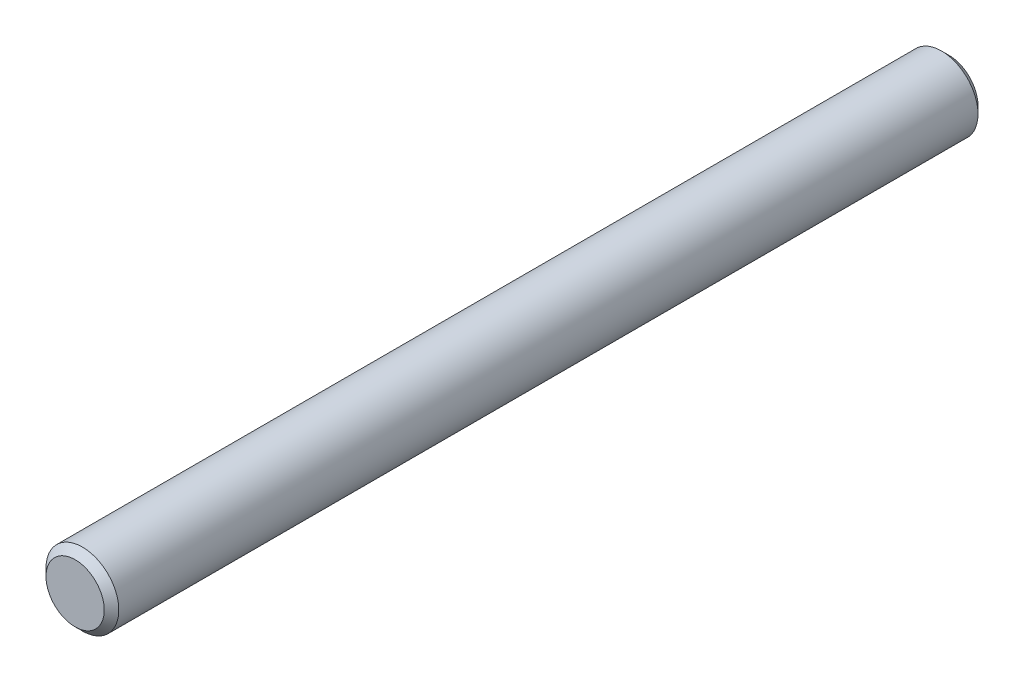
ISO-10303-21;
HEADER;
FILE_DESCRIPTION(('STEP AP214'),'2;1');
FILE_NAME('part.step','',(''),(''),'','','');
FILE_SCHEMA(('AUTOMOTIVE_DESIGN { 1 0 10303 214 1 1 1 1 }'));
ENDSEC;
DATA;
#1=APPLICATION_CONTEXT('core data for automotive mechanical design processes');
#2=APPLICATION_PROTOCOL_DEFINITION('international standard','automotive_design',2000,#1);
#3=PRODUCT_CONTEXT('',#1,'mechanical');
#4=PRODUCT('Part','Part','',(#3));
#5=PRODUCT_RELATED_PRODUCT_CATEGORY('part','',(#4));
#6=PRODUCT_DEFINITION_FORMATION('','',#4);
#7=PRODUCT_DEFINITION_CONTEXT('part definition',#1,'design');
#8=PRODUCT_DEFINITION('design','',#6,#7);
#9=PRODUCT_DEFINITION_SHAPE('','',#8);
#10=(LENGTH_UNIT() NAMED_UNIT(*) SI_UNIT(.MILLI.,.METRE.));
#11=(NAMED_UNIT(*) PLANE_ANGLE_UNIT() SI_UNIT($,.RADIAN.));
#12=(NAMED_UNIT(*) SI_UNIT($,.STERADIAN.) SOLID_ANGLE_UNIT());
#13=UNCERTAINTY_MEASURE_WITH_UNIT(LENGTH_MEASURE(1.E-05),#10,'distance_accuracy_value','');
#14=(GEOMETRIC_REPRESENTATION_CONTEXT(3) GLOBAL_UNCERTAINTY_ASSIGNED_CONTEXT((#13)) GLOBAL_UNIT_ASSIGNED_CONTEXT((#10,
#11,#12)) REPRESENTATION_CONTEXT('',''));
#15=CARTESIAN_POINT('',(0.,0.,0.));
#16=DIRECTION('',(0.,0.,1.));
#17=DIRECTION('',(1.,0.,0.));
#18=AXIS2_PLACEMENT_3D('',#15,#16,#17);
#19=CARTESIAN_POINT('',(0.,0.,38.1));
#20=DIRECTION('',(0.,0.,-1.));
#21=DIRECTION('',(-1.,0.,0.));
#22=AXIS2_PLACEMENT_3D('',#19,#20,#21);
#23=CYLINDRICAL_SURFACE('',#22,3.175);
#24=CARTESIAN_POINT('',(0.,0.,-37.4649999999999));
#25=DIRECTION('',(0.,0.,1.));
#26=DIRECTION('',(1.,0.,0.));
#27=AXIS2_PLACEMENT_3D('',#24,#25,#26);
#28=CIRCLE('',#27,3.175);
#29=CARTESIAN_POINT('',(-3.175,0.,-37.4649999999999));
#30=VERTEX_POINT('',#29);
#31=EDGE_CURVE('E41',#30,#30,#28,.T.);
#32=CARTESIAN_POINT('',(0.,0.,37.465));
#33=DIRECTION('',(0.,0.,1.));
#34=DIRECTION('',(1.,0.,0.));
#35=AXIS2_PLACEMENT_3D('',#32,#33,#34);
#36=CIRCLE('',#35,3.175);
#37=CARTESIAN_POINT('',(-3.175,0.,37.465));
#38=VERTEX_POINT('',#37);
#39=EDGE_CURVE('E45',#38,#38,#36,.F.);
#40=CARTESIAN_POINT('',(-3.175,0.,-37.4649999999999));
#41=CARTESIAN_POINT('',(-3.175,0.,-36.6844791666666));
#42=CARTESIAN_POINT('',(-3.175,0.,-35.9039583333333));
#43=CARTESIAN_POINT('',(-3.175,0.,-34.3429166666666));
#44=CARTESIAN_POINT('',(-3.175,0.,-33.5623958333333));
#45=CARTESIAN_POINT('',(-3.175,0.,-32.0013541666666));
#46=CARTESIAN_POINT('',(-3.175,0.,-31.2208333333333));
#47=CARTESIAN_POINT('',(-3.175,0.,-29.6597916666666));
#48=CARTESIAN_POINT('',(-3.175,0.,-28.8792708333333));
#49=CARTESIAN_POINT('',(-3.175,0.,-27.3182291666666));
#50=CARTESIAN_POINT('',(-3.175,0.,-26.5377083333333));
#51=CARTESIAN_POINT('',(-3.175,0.,-24.9766666666666));
#52=CARTESIAN_POINT('',(-3.175,0.,-24.1961458333333));
#53=CARTESIAN_POINT('',(-3.175,0.,-22.6351041666666));
#54=CARTESIAN_POINT('',(-3.175,0.,-21.8545833333333));
#55=CARTESIAN_POINT('',(-3.175,0.,-20.2935416666666));
#56=CARTESIAN_POINT('',(-3.175,0.,-19.5130208333333));
#57=CARTESIAN_POINT('',(-3.175,0.,-17.9519791666666));
#58=CARTESIAN_POINT('',(-3.175,0.,-17.1714583333333));
#59=CARTESIAN_POINT('',(-3.175,0.,-15.6104166666666));
#60=CARTESIAN_POINT('',(-3.175,0.,-14.8298958333333));
#61=CARTESIAN_POINT('',(-3.175,0.,-13.2688541666666));
#62=CARTESIAN_POINT('',(-3.175,0.,-12.4883333333333));
#63=CARTESIAN_POINT('',(-3.175,0.,-10.9272916666666));
#64=CARTESIAN_POINT('',(-3.175,0.,-10.1467708333333));
#65=CARTESIAN_POINT('',(-3.175,0.,-8.58572916666663));
#66=CARTESIAN_POINT('',(-3.175,0.,-7.80520833333329));
#67=CARTESIAN_POINT('',(-3.175,0.,-6.24416666666663));
#68=CARTESIAN_POINT('',(-3.175,0.,-5.46364583333329));
#69=CARTESIAN_POINT('',(-3.175,0.,-3.90260416666663));
#70=CARTESIAN_POINT('',(-3.175,0.,-3.1220833333333));
#71=CARTESIAN_POINT('',(-3.175,0.,-1.56104166666663));
#72=CARTESIAN_POINT('',(-3.175,0.,-0.780520833333298));
#73=CARTESIAN_POINT('',(-3.175,0.,0.780520833333367));
#74=CARTESIAN_POINT('',(-3.175,0.,1.5610416666667));
#75=CARTESIAN_POINT('',(-3.175,0.,3.12208333333337));
#76=CARTESIAN_POINT('',(-3.175,0.,3.9026041666667));
#77=CARTESIAN_POINT('',(-3.175,0.,5.46364583333337));
#78=CARTESIAN_POINT('',(-3.175,0.,6.2441666666667));
#79=CARTESIAN_POINT('',(-3.175,0.,7.80520833333337));
#80=CARTESIAN_POINT('',(-3.175,0.,8.5857291666667));
#81=CARTESIAN_POINT('',(-3.175,0.,10.1467708333334));
#82=CARTESIAN_POINT('',(-3.175,0.,10.9272916666667));
#83=CARTESIAN_POINT('',(-3.175,0.,12.4883333333334));
#84=CARTESIAN_POINT('',(-3.175,0.,13.2688541666667));
#85=CARTESIAN_POINT('',(-3.175,0.,14.8298958333334));
#86=CARTESIAN_POINT('',(-3.175,0.,15.6104166666667));
#87=CARTESIAN_POINT('',(-3.175,0.,17.1714583333334));
#88=CARTESIAN_POINT('',(-3.175,0.,17.9519791666667));
#89=CARTESIAN_POINT('',(-3.175,0.,19.5130208333334));
#90=CARTESIAN_POINT('',(-3.175,0.,20.2935416666667));
#91=CARTESIAN_POINT('',(-3.175,0.,21.8545833333334));
#92=CARTESIAN_POINT('',(-3.175,0.,22.6351041666667));
#93=CARTESIAN_POINT('',(-3.175,0.,24.1961458333334));
#94=CARTESIAN_POINT('',(-3.175,0.,24.9766666666667));
#95=CARTESIAN_POINT('',(-3.175,0.,26.5377083333334));
#96=CARTESIAN_POINT('',(-3.175,0.,27.3182291666667));
#97=CARTESIAN_POINT('',(-3.175,0.,28.8792708333334));
#98=CARTESIAN_POINT('',(-3.175,0.,29.6597916666667));
#99=CARTESIAN_POINT('',(-3.175,0.,31.2208333333334));
#100=CARTESIAN_POINT('',(-3.175,0.,32.0013541666667));
#101=CARTESIAN_POINT('',(-3.175,0.,33.5623958333334));
#102=CARTESIAN_POINT('',(-3.175,0.,34.3429166666667));
#103=CARTESIAN_POINT('',(-3.175,0.,35.9039583333333));
#104=CARTESIAN_POINT('',(-3.175,0.,36.6844791666667));
#105=CARTESIAN_POINT('',(-3.175,0.,37.465));
#106=B_SPLINE_CURVE_WITH_KNOTS('',3,(#40,#41,#42,#43,#44,#45,#46,#47,#48,#49,#50,#51,#52,#53,
#54,#55,#56,#57,#58,#59,#60,#61,#62,#63,#64,#65,#66,#67,#68,#69,#70,#71,#72,#73,#74,#75,#76,#77,
#78,#79,#80,#81,#82,#83,#84,#85,#86,#87,#88,#89,#90,#91,#92,#93,#94,#95,#96,#97,#98,#99,#100,
#101,#102,#103,#104,#105),.UNSPECIFIED.,.F.,.F.,(4,2,2,2,2,2,2,2,2,2,2,2,2,2,2,2,2,2,2,2,2,2,2,
2,2,2,2,2,2,2,2,2,4),(0.,2.34156250000001,4.683125,7.0246875,9.36624999999999,11.7078125,
14.049375,16.3909375,18.7325,21.0740625,23.415625,25.7571875,28.09875,30.4403125,32.781875,
35.1234375,37.465,39.8065625,42.148125,44.4896875,46.83125,49.1728125,51.514375,53.8559375,
56.1975,58.5390625,60.880625,63.2221875,65.56375,67.9053125,70.246875,72.5884375,74.93),.UNSPECIFIED.);
#107=EDGE_CURVE('BSEAM30',#30,#38,#106,.T.);
#108=ORIENTED_EDGE('',*,*,#31,.T.);
#109=ORIENTED_EDGE('',*,*,#39,.T.);
#110=ORIENTED_EDGE('',*,*,#107,.T.);
#111=ORIENTED_EDGE('',*,*,#107,.F.);
#112=EDGE_LOOP('',(#108,#110,#109,#111));
#113=FACE_BOUND('',#112,.T.);
#114=ADVANCED_FACE('F30',(#113),#23,.T.);
#115=CARTESIAN_POINT('',(0.,0.,38.1));
#116=DIRECTION('',(0.,0.,1.));
#117=DIRECTION('',(1.,0.,0.));
#118=AXIS2_PLACEMENT_3D('',#115,#116,#117);
#119=PLANE('',#118);
#120=CARTESIAN_POINT('',(0.,0.,38.1));
#121=DIRECTION('',(0.,0.,1.));
#122=DIRECTION('',(1.,0.,0.));
#123=AXIS2_PLACEMENT_3D('',#120,#121,#122);
#124=CIRCLE('',#123,2.54000000000002);
#125=CARTESIAN_POINT('',(-2.54000000000002,0.,38.1));
#126=VERTEX_POINT('',#125);
#127=EDGE_CURVE('E10',#126,#126,#124,.T.);
#128=ORIENTED_EDGE('',*,*,#127,.T.);
#129=EDGE_LOOP('',(#128));
#130=FACE_BOUND('',#129,.T.);
#131=ADVANCED_FACE('F61',(#130),#119,.T.);
#132=CARTESIAN_POINT('',(0.,0.,-38.1));
#133=DIRECTION('',(0.,0.,1.));
#134=DIRECTION('',(1.,0.,0.));
#135=AXIS2_PLACEMENT_3D('',#132,#133,#134);
#136=PLANE('',#135);
#137=CARTESIAN_POINT('',(0.,0.,-38.1));
#138=DIRECTION('',(0.,0.,1.));
#139=DIRECTION('',(1.,0.,0.));
#140=AXIS2_PLACEMENT_3D('',#137,#138,#139);
#141=CIRCLE('',#140,2.53999999999994);
#142=CARTESIAN_POINT('',(2.53999999999994,0.,-38.1));
#143=VERTEX_POINT('',#142);
#144=EDGE_CURVE('E37',#143,#143,#141,.F.);
#145=ORIENTED_EDGE('',*,*,#144,.T.);
#146=EDGE_LOOP('',(#145));
#147=FACE_BOUND('',#146,.T.);
#148=ADVANCED_FACE('F58',(#147),#136,.F.);
#149=CARTESIAN_POINT('',(0.,0.,-37.4649999999999));
#150=DIRECTION('',(0.,0.,1.));
#151=DIRECTION('',(1.,0.,0.));
#152=AXIS2_PLACEMENT_3D('',#149,#150,#151);
#153=CONICAL_SURFACE('',#152,3.175,0.785398163397445);
#154=ORIENTED_EDGE('',*,*,#144,.F.);
#155=EDGE_LOOP('',(#154));
#156=FACE_BOUND('',#155,.T.);
#157=ORIENTED_EDGE('',*,*,#31,.F.);
#158=EDGE_LOOP('',(#157));
#159=FACE_BOUND('',#158,.T.);
#160=ADVANCED_FACE('F54',(#156,#159),#153,.T.);
#161=CARTESIAN_POINT('',(0.,0.,38.1));
#162=DIRECTION('',(0.,0.,-1.));
#163=DIRECTION('',(-1.,0.,0.));
#164=AXIS2_PLACEMENT_3D('',#161,#162,#163);
#165=CONICAL_SURFACE('',#164,2.54000000000002,0.785398163397445);
#166=CARTESIAN_POINT('',(-3.175,0.,37.465));
#167=CARTESIAN_POINT('',(-3.16838541666667,0.,37.4716145833334));
#168=CARTESIAN_POINT('',(-3.16177083333334,0.,37.4782291666667));
#169=CARTESIAN_POINT('',(-3.14854166666667,0.,37.4914583333334));
#170=CARTESIAN_POINT('',(-3.14192708333334,0.,37.4980729166667));
#171=CARTESIAN_POINT('',(-3.12869791666667,0.,37.5113020833333));
#172=CARTESIAN_POINT('',(-3.12208333333334,0.,37.5179166666667));
#173=CARTESIAN_POINT('',(-3.10885416666667,0.,37.5311458333333));
#174=CARTESIAN_POINT('',(-3.10223958333334,0.,37.5377604166667));
#175=CARTESIAN_POINT('',(-3.08901041666667,0.,37.5509895833333));
#176=CARTESIAN_POINT('',(-3.08239583333334,0.,37.5576041666667));
#177=CARTESIAN_POINT('',(-3.06916666666667,0.,37.5708333333333));
#178=CARTESIAN_POINT('',(-3.06255208333334,0.,37.5774479166667));
#179=CARTESIAN_POINT('',(-3.04932291666668,0.,37.5906770833333));
#180=CARTESIAN_POINT('',(-3.04270833333334,0.,37.5972916666667));
#181=CARTESIAN_POINT('',(-3.02947916666667,0.,37.6105208333333));
#182=CARTESIAN_POINT('',(-3.02286458333334,0.,37.6171354166667));
#183=CARTESIAN_POINT('',(-3.00963541666668,0.,37.6303645833333));
#184=CARTESIAN_POINT('',(-3.00302083333334,0.,37.6369791666667));
#185=CARTESIAN_POINT('',(-2.98979166666668,0.,37.6502083333333));
#186=CARTESIAN_POINT('',(-2.98317708333334,0.,37.6568229166667));
#187=CARTESIAN_POINT('',(-2.96994791666668,0.,37.6700520833333));
#188=CARTESIAN_POINT('',(-2.96333333333334,0.,37.6766666666667));
#189=CARTESIAN_POINT('',(-2.95010416666668,0.,37.6898958333333));
#190=CARTESIAN_POINT('',(-2.94348958333334,0.,37.6965104166667));
#191=CARTESIAN_POINT('',(-2.93026041666668,0.,37.7097395833333));
#192=CARTESIAN_POINT('',(-2.92364583333335,0.,37.7163541666667));
#193=CARTESIAN_POINT('',(-2.91041666666668,0.,37.7295833333333));
#194=CARTESIAN_POINT('',(-2.90380208333335,0.,37.7361979166667));
#195=CARTESIAN_POINT('',(-2.89057291666668,0.,37.7494270833333));
#196=CARTESIAN_POINT('',(-2.88395833333335,0.,37.7560416666667));
#197=CARTESIAN_POINT('',(-2.87072916666668,0.,37.7692708333333));
#198=CARTESIAN_POINT('',(-2.86411458333335,0.,37.7758854166667));
#199=CARTESIAN_POINT('',(-2.85088541666668,0.,37.7891145833333));
#200=CARTESIAN_POINT('',(-2.84427083333335,0.,37.7957291666667));
#201=CARTESIAN_POINT('',(-2.83104166666668,0.,37.8089583333333));
#202=CARTESIAN_POINT('',(-2.82442708333335,0.,37.8155729166667));
#203=CARTESIAN_POINT('',(-2.81119791666668,0.,37.8288020833333));
#204=CARTESIAN_POINT('',(-2.80458333333335,0.,37.8354166666667));
#205=CARTESIAN_POINT('',(-2.79135416666668,0.,37.8486458333333));
#206=CARTESIAN_POINT('',(-2.78473958333335,0.,37.8552604166667));
#207=CARTESIAN_POINT('',(-2.77151041666668,0.,37.8684895833333));
#208=CARTESIAN_POINT('',(-2.76489583333335,0.,37.8751041666667));
#209=CARTESIAN_POINT('',(-2.75166666666668,0.,37.8883333333333));
#210=CARTESIAN_POINT('',(-2.74505208333335,0.,37.8949479166667));
#211=CARTESIAN_POINT('',(-2.73182291666669,0.,37.9081770833333));
#212=CARTESIAN_POINT('',(-2.72520833333335,0.,37.9147916666667));
#213=CARTESIAN_POINT('',(-2.71197916666669,0.,37.9280208333333));
#214=CARTESIAN_POINT('',(-2.70536458333335,0.,37.9346354166667));
#215=CARTESIAN_POINT('',(-2.69213541666669,0.,37.9478645833333));
#216=CARTESIAN_POINT('',(-2.68552083333335,0.,37.9544791666667));
#217=CARTESIAN_POINT('',(-2.67229166666669,0.,37.9677083333333));
#218=CARTESIAN_POINT('',(-2.66567708333335,0.,37.9743229166667));
#219=CARTESIAN_POINT('',(-2.65244791666669,0.,37.9875520833333));
#220=CARTESIAN_POINT('',(-2.64583333333335,0.,37.9941666666667));
#221=CARTESIAN_POINT('',(-2.63260416666669,0.,38.0073958333333));
#222=CARTESIAN_POINT('',(-2.62598958333336,0.,38.0140104166667));
#223=CARTESIAN_POINT('',(-2.61276041666669,0.,38.0272395833333));
#224=CARTESIAN_POINT('',(-2.60614583333336,0.,38.0338541666667));
#225=CARTESIAN_POINT('',(-2.59291666666669,0.,38.0470833333333));
#226=CARTESIAN_POINT('',(-2.58630208333336,0.,38.0536979166667));
#227=CARTESIAN_POINT('',(-2.57307291666669,0.,38.0669270833333));
#228=CARTESIAN_POINT('',(-2.56645833333336,0.,38.0735416666667));
#229=CARTESIAN_POINT('',(-2.55322916666669,0.,38.0867708333333));
#230=CARTESIAN_POINT('',(-2.54661458333336,0.,38.0933854166667));
#231=CARTESIAN_POINT('',(-2.54000000000002,0.,38.1));
#232=B_SPLINE_CURVE_WITH_KNOTS('',3,(#166,#167,#168,#169,#170,#171,#172,#173,#174,#175,#176,
#177,#178,#179,#180,#181,#182,#183,#184,#185,#186,#187,#188,#189,#190,#191,#192,#193,#194,#195,
#196,#197,#198,#199,#200,#201,#202,#203,#204,#205,#206,#207,#208,#209,#210,#211,#212,#213,#214,
#215,#216,#217,#218,#219,#220,#221,#222,#223,#224,#225,#226,#227,#228,#229,#230,#231),
.UNSPECIFIED.,.F.,.F.,(4,2,2,2,2,2,2,2,2,2,2,2,2,2,2,2,2,2,2,2,2,2,2,2,2,2,2,2,2,2,2,2,4),(0.,
0.0280633003783394,0.0561266007566788,0.084189901135018,0.112253201513357,0.140316501891697,
0.168379802270041,0.19644310264838,0.22450640302672,0.252569703405059,0.280633003783398,
0.308696304161743,0.336759604540082,0.364822904918421,0.39288620529676,0.4209495056751,
0.449012806053444,0.477076106431783,0.505139406810123,0.533202707188462,0.561266007566801,
0.589329307945141,0.617392608323485,0.645455908701824,0.673519209080164,0.701582509458503,
0.729645809836842,0.757709110215186,0.785772410593526,0.813835710971865,0.841899011350205,
0.869962311728544,0.898025612106888),.UNSPECIFIED.);
#233=EDGE_CURVE('BSEAM32',#38,#126,#232,.T.);
#234=ORIENTED_EDGE('',*,*,#39,.F.);
#235=ORIENTED_EDGE('',*,*,#127,.F.);
#236=ORIENTED_EDGE('',*,*,#233,.T.);
#237=ORIENTED_EDGE('',*,*,#233,.F.);
#238=EDGE_LOOP('',(#234,#236,#235,#237));
#239=FACE_BOUND('',#238,.T.);
#240=ADVANCED_FACE('F32',(#239),#165,.T.);
#241=CLOSED_SHELL('',(#114,#131,#148,#160,#240));
#242=MANIFOLD_SOLID_BREP('B2',#241);
#243=ADVANCED_BREP_SHAPE_REPRESENTATION('',(#18,#242),#14);
#244=SHAPE_DEFINITION_REPRESENTATION(#9,#243);
ENDSEC;
END-ISO-10303-21;
